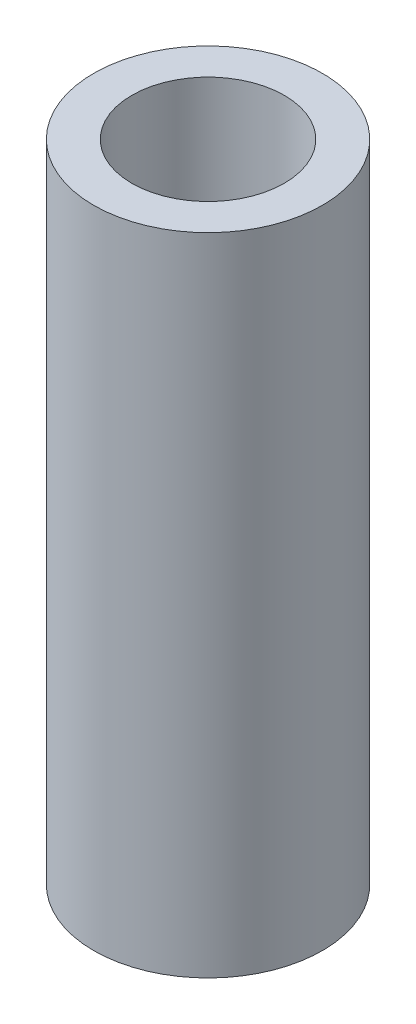
ISO-10303-21;
HEADER;
FILE_DESCRIPTION(('STEP AP214'),'2;1');
FILE_NAME('part.step','',(''),(''),'','','');
FILE_SCHEMA(('AUTOMOTIVE_DESIGN { 1 0 10303 214 1 1 1 1 }'));
ENDSEC;
DATA;
#1=APPLICATION_CONTEXT('core data for automotive mechanical design processes');
#2=APPLICATION_PROTOCOL_DEFINITION('international standard','automotive_design',2000,#1);
#3=PRODUCT_CONTEXT('',#1,'mechanical');
#4=PRODUCT('Part','Part','',(#3));
#5=PRODUCT_RELATED_PRODUCT_CATEGORY('part','',(#4));
#6=PRODUCT_DEFINITION_FORMATION('','',#4);
#7=PRODUCT_DEFINITION_CONTEXT('part definition',#1,'design');
#8=PRODUCT_DEFINITION('design','',#6,#7);
#9=PRODUCT_DEFINITION_SHAPE('','',#8);
#10=(LENGTH_UNIT() NAMED_UNIT(*) SI_UNIT(.MILLI.,.METRE.));
#11=(NAMED_UNIT(*) PLANE_ANGLE_UNIT() SI_UNIT($,.RADIAN.));
#12=(NAMED_UNIT(*) SI_UNIT($,.STERADIAN.) SOLID_ANGLE_UNIT());
#13=UNCERTAINTY_MEASURE_WITH_UNIT(LENGTH_MEASURE(1.E-05),#10,'distance_accuracy_value','');
#14=(GEOMETRIC_REPRESENTATION_CONTEXT(3) GLOBAL_UNCERTAINTY_ASSIGNED_CONTEXT((#13)) GLOBAL_UNIT_ASSIGNED_CONTEXT((#10,
#11,#12)) REPRESENTATION_CONTEXT('',''));
#15=CARTESIAN_POINT('',(0.,0.,0.));
#16=DIRECTION('',(0.,0.,1.));
#17=DIRECTION('',(1.,0.,0.));
#18=AXIS2_PLACEMENT_3D('',#15,#16,#17);
#19=CARTESIAN_POINT('',(0.,25.4,0.));
#20=DIRECTION('',(0.,1.,0.));
#21=DIRECTION('',(0.,0.,1.));
#22=AXIS2_PLACEMENT_3D('',#19,#20,#21);
#23=PLANE('',#22);
#24=CARTESIAN_POINT('',(0.,25.4,0.));
#25=DIRECTION('',(0.,1.,0.));
#26=DIRECTION('',(0.,0.,1.));
#27=AXIS2_PLACEMENT_3D('',#24,#25,#26);
#28=CIRCLE('',#27,4.5);
#29=CARTESIAN_POINT('',(0.,25.4,4.5));
#30=VERTEX_POINT('',#29);
#31=EDGE_CURVE('E10',#30,#30,#28,.T.);
#32=ORIENTED_EDGE('',*,*,#31,.T.);
#33=EDGE_LOOP('',(#32));
#34=FACE_BOUND('',#33,.T.);
#35=CARTESIAN_POINT('',(0.,25.4,0.));
#36=DIRECTION('',(0.,1.,0.));
#37=DIRECTION('',(0.,0.,1.));
#38=AXIS2_PLACEMENT_3D('',#35,#36,#37);
#39=CIRCLE('',#38,3.);
#40=CARTESIAN_POINT('',(0.,25.4,3.));
#41=VERTEX_POINT('',#40);
#42=EDGE_CURVE('E50',#41,#41,#39,.T.);
#43=ORIENTED_EDGE('',*,*,#42,.F.);
#44=EDGE_LOOP('',(#43));
#45=FACE_BOUND('',#44,.T.);
#46=ADVANCED_FACE('F37',(#34,#45),#23,.T.);
#47=CARTESIAN_POINT('',(0.,0.,0.));
#48=DIRECTION('',(0.,1.,0.));
#49=DIRECTION('',(0.,0.,1.));
#50=AXIS2_PLACEMENT_3D('',#47,#48,#49);
#51=PLANE('',#50);
#52=CARTESIAN_POINT('',(0.,0.,0.));
#53=DIRECTION('',(0.,1.,0.));
#54=DIRECTION('',(0.,0.,1.));
#55=AXIS2_PLACEMENT_3D('',#52,#53,#54);
#56=CIRCLE('',#55,4.5);
#57=CARTESIAN_POINT('',(0.,0.,4.5));
#58=VERTEX_POINT('',#57);
#59=EDGE_CURVE('E41',#58,#58,#56,.T.);
#60=ORIENTED_EDGE('',*,*,#59,.F.);
#61=EDGE_LOOP('',(#60));
#62=FACE_BOUND('',#61,.T.);
#63=CARTESIAN_POINT('',(0.,0.,0.));
#64=DIRECTION('',(0.,1.,0.));
#65=DIRECTION('',(0.,0.,1.));
#66=AXIS2_PLACEMENT_3D('',#63,#64,#65);
#67=CIRCLE('',#66,3.);
#68=CARTESIAN_POINT('',(0.,0.,3.));
#69=VERTEX_POINT('',#68);
#70=EDGE_CURVE('E52',#69,#69,#67,.T.);
#71=ORIENTED_EDGE('',*,*,#70,.T.);
#72=EDGE_LOOP('',(#71));
#73=FACE_BOUND('',#72,.T.);
#74=ADVANCED_FACE('F64',(#62,#73),#51,.F.);
#75=CARTESIAN_POINT('',(0.,25.4,0.));
#76=DIRECTION('',(0.,-1.,0.));
#77=DIRECTION('',(0.,0.,-1.));
#78=AXIS2_PLACEMENT_3D('',#75,#76,#77);
#79=CYLINDRICAL_SURFACE('',#78,4.5);
#80=ORIENTED_EDGE('',*,*,#31,.F.);
#81=EDGE_LOOP('',(#80));
#82=FACE_BOUND('',#81,.T.);
#83=ORIENTED_EDGE('',*,*,#59,.T.);
#84=EDGE_LOOP('',(#83));
#85=FACE_BOUND('',#84,.T.);
#86=ADVANCED_FACE('F39',(#82,#85),#79,.T.);
#87=CARTESIAN_POINT('',(0.,25.4,0.));
#88=DIRECTION('',(0.,-1.,0.));
#89=DIRECTION('',(0.,0.,-1.));
#90=AXIS2_PLACEMENT_3D('',#87,#88,#89);
#91=CYLINDRICAL_SURFACE('',#90,3.);
#92=ORIENTED_EDGE('',*,*,#42,.T.);
#93=EDGE_LOOP('',(#92));
#94=FACE_BOUND('',#93,.T.);
#95=ORIENTED_EDGE('',*,*,#70,.F.);
#96=EDGE_LOOP('',(#95));
#97=FACE_BOUND('',#96,.T.);
#98=ADVANCED_FACE('F60',(#94,#97),#91,.F.);
#99=CLOSED_SHELL('',(#46,#74,#86,#98));
#100=MANIFOLD_SOLID_BREP('B2',#99);
#101=ADVANCED_BREP_SHAPE_REPRESENTATION('',(#18,#100),#14);
#102=SHAPE_DEFINITION_REPRESENTATION(#9,#101);
ENDSEC;
END-ISO-10303-21;
